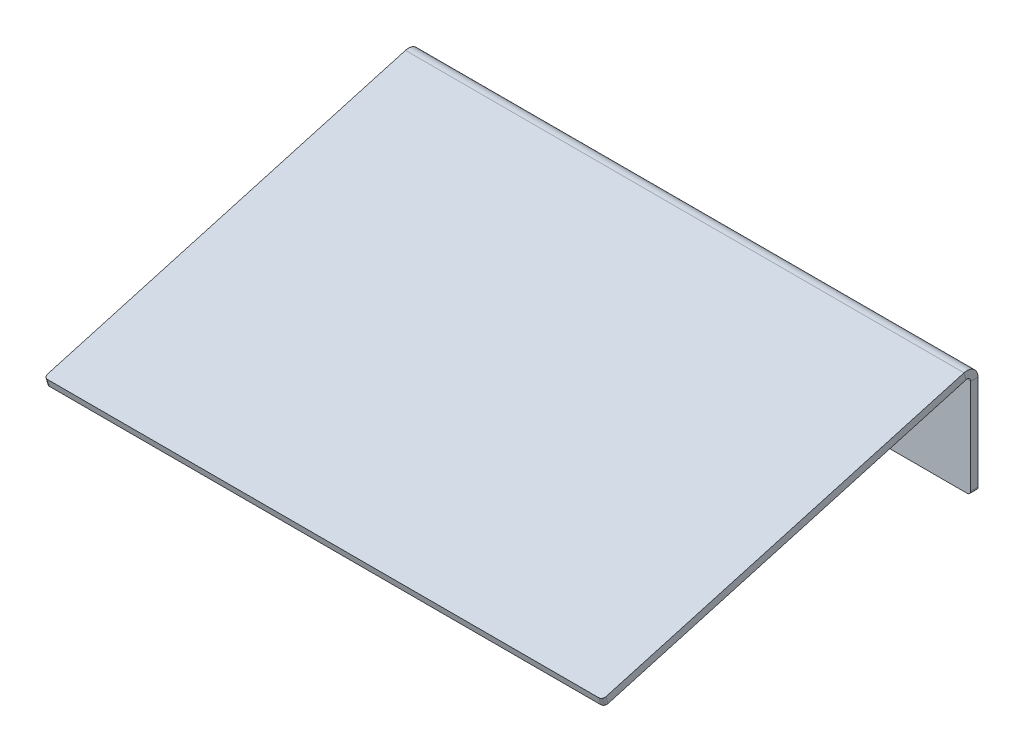
ISO-10303-21;
HEADER;
FILE_DESCRIPTION(('STEP AP214'),'2;1');
FILE_NAME('part.step','',(''),(''),'','','');
FILE_SCHEMA(('AUTOMOTIVE_DESIGN { 1 0 10303 214 1 1 1 1 }'));
ENDSEC;
DATA;
#1=APPLICATION_CONTEXT('core data for automotive mechanical design processes');
#2=APPLICATION_PROTOCOL_DEFINITION('international standard','automotive_design',2000,#1);
#3=PRODUCT_CONTEXT('',#1,'mechanical');
#4=PRODUCT('Part','Part','',(#3));
#5=PRODUCT_RELATED_PRODUCT_CATEGORY('part','',(#4));
#6=PRODUCT_DEFINITION_FORMATION('','',#4);
#7=PRODUCT_DEFINITION_CONTEXT('part definition',#1,'design');
#8=PRODUCT_DEFINITION('design','',#6,#7);
#9=PRODUCT_DEFINITION_SHAPE('','',#8);
#10=(LENGTH_UNIT() NAMED_UNIT(*) SI_UNIT(.MILLI.,.METRE.));
#11=(NAMED_UNIT(*) PLANE_ANGLE_UNIT() SI_UNIT($,.RADIAN.));
#12=(NAMED_UNIT(*) SI_UNIT($,.STERADIAN.) SOLID_ANGLE_UNIT());
#13=UNCERTAINTY_MEASURE_WITH_UNIT(LENGTH_MEASURE(1.E-05),#10,'distance_accuracy_value','');
#14=(GEOMETRIC_REPRESENTATION_CONTEXT(3) GLOBAL_UNCERTAINTY_ASSIGNED_CONTEXT((#13)) GLOBAL_UNIT_ASSIGNED_CONTEXT((#10,
#11,#12)) REPRESENTATION_CONTEXT('',''));
#15=CARTESIAN_POINT('',(0.,0.,0.));
#16=DIRECTION('',(0.,0.,1.));
#17=DIRECTION('',(1.,0.,0.));
#18=AXIS2_PLACEMENT_3D('',#15,#16,#17);
#19=CARTESIAN_POINT('',(152.5,0.,0.));
#20=DIRECTION('',(0.,1.,0.));
#21=DIRECTION('',(-1.,0.,0.));
#22=AXIS2_PLACEMENT_3D('',#19,#20,#21);
#23=PLANE('',#22);
#24=DIRECTION('',(1.,0.,0.));
#25=VECTOR('',#24,1.);
#26=CARTESIAN_POINT('',(152.5,0.,-4.));
#27=LINE('',#26,#25);
#28=CARTESIAN_POINT('',(150.5,0.,-4.));
#29=VERTEX_POINT('',#28);
#30=CARTESIAN_POINT('',(-150.5,0.,-4.));
#31=VERTEX_POINT('',#30);
#32=EDGE_CURVE('E202',#29,#31,#27,.F.);
#33=ORIENTED_EDGE('',*,*,#32,.F.);
#34=DIRECTION('',(0.,0.,1.));
#35=VECTOR('',#34,1.);
#36=CARTESIAN_POINT('',(150.5,0.,0.));
#37=LINE('',#36,#35);
#38=CARTESIAN_POINT('',(150.5,0.,0.));
#39=VERTEX_POINT('',#38);
#40=EDGE_CURVE('E213',#29,#39,#37,.T.);
#41=ORIENTED_EDGE('',*,*,#40,.T.);
#42=DIRECTION('',(-1.,0.,0.));
#43=VECTOR('',#42,1.);
#44=CARTESIAN_POINT('',(152.5,0.,0.));
#45=LINE('',#44,#43);
#46=CARTESIAN_POINT('',(-150.5,0.,0.));
#47=VERTEX_POINT('',#46);
#48=EDGE_CURVE('E141',#39,#47,#45,.T.);
#49=ORIENTED_EDGE('',*,*,#48,.T.);
#50=DIRECTION('',(0.,0.,-1.));
#51=VECTOR('',#50,1.);
#52=CARTESIAN_POINT('',(-150.5,0.,0.));
#53=LINE('',#52,#51);
#54=EDGE_CURVE('E152',#47,#31,#53,.T.);
#55=ORIENTED_EDGE('',*,*,#54,.T.);
#56=EDGE_LOOP('',(#33,#41,#49,#55));
#57=FACE_BOUND('',#56,.T.);
#58=ADVANCED_FACE('F38',(#57),#23,.F.);
#59=CARTESIAN_POINT('',(152.5,54.,0.));
#60=DIRECTION('',(1.,0.,0.));
#61=DIRECTION('',(0.,1.,0.));
#62=AXIS2_PLACEMENT_3D('',#59,#60,#61);
#63=PLANE('',#62);
#64=DIRECTION('',(0.,1.,0.));
#65=VECTOR('',#64,1.);
#66=CARTESIAN_POINT('',(152.5,54.,0.));
#67=LINE('',#66,#65);
#68=CARTESIAN_POINT('',(152.5,2.,0.));
#69=VERTEX_POINT('',#68);
#70=CARTESIAN_POINT('',(152.5,54.,0.));
#71=VERTEX_POINT('',#70);
#72=EDGE_CURVE('E131',#69,#71,#67,.T.);
#73=ORIENTED_EDGE('',*,*,#72,.F.);
#74=DIRECTION('',(0.,0.,-1.));
#75=VECTOR('',#74,1.);
#76=CARTESIAN_POINT('',(152.5,2.,0.));
#77=LINE('',#76,#75);
#78=CARTESIAN_POINT('',(152.5,2.,-4.));
#79=VERTEX_POINT('',#78);
#80=EDGE_CURVE('E219',#69,#79,#77,.T.);
#81=ORIENTED_EDGE('',*,*,#80,.T.);
#82=DIRECTION('',(0.,-1.,0.));
#83=VECTOR('',#82,1.);
#84=CARTESIAN_POINT('',(152.5,54.,-4.));
#85=LINE('',#84,#83);
#86=CARTESIAN_POINT('',(152.5,54.,-4.));
#87=VERTEX_POINT('',#86);
#88=EDGE_CURVE('E148',#79,#87,#85,.F.);
#89=ORIENTED_EDGE('',*,*,#88,.T.);
#90=DIRECTION('',(0.,0.,1.));
#91=VECTOR('',#90,1.);
#92=CARTESIAN_POINT('',(152.5,54.,0.));
#93=LINE('',#92,#91);
#94=EDGE_CURVE('E144',#87,#71,#93,.T.);
#95=ORIENTED_EDGE('',*,*,#94,.T.);
#96=EDGE_LOOP('',(#73,#81,#89,#95));
#97=FACE_BOUND('',#96,.T.);
#98=ADVANCED_FACE('F146',(#97),#63,.T.);
#99=CARTESIAN_POINT('',(152.5,54.,2.));
#100=DIRECTION('',(-1.,0.,0.));
#101=DIRECTION('',(0.,0.,1.));
#102=AXIS2_PLACEMENT_3D('',#99,#100,#101);
#103=PLANE('',#102);
#104=ORIENTED_EDGE('',*,*,#94,.F.);
#105=CARTESIAN_POINT('',(152.5,54.,2.));
#106=DIRECTION('',(-1.,0.,0.));
#107=DIRECTION('',(0.,0.,1.));
#108=AXIS2_PLACEMENT_3D('',#105,#106,#107);
#109=CIRCLE('',#108,5.99999999999999);
#110=CARTESIAN_POINT('',(152.5,59.7729234440283,3.63503972715922));
#111=VERTEX_POINT('',#110);
#112=EDGE_CURVE('E193',#87,#111,#109,.F.);
#113=ORIENTED_EDGE('',*,*,#112,.T.);
#114=DIRECTION('',(0.,-0.962153907338043,-0.272506621193204));
#115=VECTOR('',#114,1.);
#116=CARTESIAN_POINT('',(152.5,55.9243078146761,2.54501324238641));
#117=LINE('',#116,#115);
#118=CARTESIAN_POINT('',(152.5,55.9243078146761,2.54501324238641));
#119=VERTEX_POINT('',#118);
#120=EDGE_CURVE('E153',#111,#119,#117,.T.);
#121=ORIENTED_EDGE('',*,*,#120,.T.);
#122=CARTESIAN_POINT('',(152.5,54.,2.));
#123=DIRECTION('',(1.,0.,0.));
#124=DIRECTION('',(0.,0.,-1.));
#125=AXIS2_PLACEMENT_3D('',#122,#123,#124);
#126=CIRCLE('',#125,1.99999999999999);
#127=EDGE_CURVE('E156',#71,#119,#126,.T.);
#128=ORIENTED_EDGE('',*,*,#127,.F.);
#129=EDGE_LOOP('',(#104,#113,#121,#128));
#130=FACE_BOUND('',#129,.T.);
#131=ADVANCED_FACE('F157',(#130),#103,.F.);
#132=CARTESIAN_POINT('',(152.5,55.9243078146761,2.54501324238641));
#133=DIRECTION('',(1.,0.,0.));
#134=DIRECTION('',(0.,-0.272506621193204,0.962153907338043));
#135=AXIS2_PLACEMENT_3D('',#132,#133,#134);
#136=PLANE('',#135);
#137=DIRECTION('',(0.,0.272506621193204,-0.962153907338043));
#138=VECTOR('',#137,1.);
#139=CARTESIAN_POINT('',(152.5,59.7729234440283,3.63503972715922));
#140=LINE('',#139,#138);
#141=CARTESIAN_POINT('',(152.5,4.3936288717386,199.165718670097));
#142=VERTEX_POINT('',#141);
#143=EDGE_CURVE('E189',#111,#142,#140,.F.);
#144=ORIENTED_EDGE('',*,*,#143,.T.);
#145=DIRECTION('',(0.,-0.962153907338043,-0.272506621193204));
#146=VECTOR('',#145,1.);
#147=CARTESIAN_POINT('',(152.5,0.545013242386427,198.075692185324));
#148=LINE('',#147,#146);
#149=CARTESIAN_POINT('',(152.5,0.545013242386427,198.075692185324));
#150=VERTEX_POINT('',#149);
#151=EDGE_CURVE('E11',#142,#150,#148,.T.);
#152=ORIENTED_EDGE('',*,*,#151,.T.);
#153=DIRECTION('',(0.,-0.272506621193204,0.962153907338043));
#154=VECTOR('',#153,1.);
#155=CARTESIAN_POINT('',(152.5,55.9243078146761,2.54501324238641));
#156=LINE('',#155,#154);
#157=EDGE_CURVE('E175',#119,#150,#156,.T.);
#158=ORIENTED_EDGE('',*,*,#157,.F.);
#159=ORIENTED_EDGE('',*,*,#120,.F.);
#160=EDGE_LOOP('',(#144,#152,#158,#159));
#161=FACE_BOUND('',#160,.T.);
#162=ADVANCED_FACE('F308',(#161),#136,.T.);
#163=CARTESIAN_POINT('',(152.5,0.,200.));
#164=DIRECTION('',(0.,-0.272506621193204,0.962153907338043));
#165=DIRECTION('',(-1.,0.,0.));
#166=AXIS2_PLACEMENT_3D('',#163,#164,#165);
#167=PLANE('',#166);
#168=DIRECTION('',(1.,0.,0.));
#169=VECTOR('',#168,1.);
#170=CARTESIAN_POINT('',(152.5,3.84861562935217,201.090026484773));
#171=LINE('',#170,#169);
#172=CARTESIAN_POINT('',(150.5,3.84861562935217,201.090026484773));
#173=VERTEX_POINT('',#172);
#174=CARTESIAN_POINT('',(-150.5,3.84861562935217,201.090026484773));
#175=VERTEX_POINT('',#174);
#176=EDGE_CURVE('E194',#173,#175,#171,.F.);
#177=ORIENTED_EDGE('',*,*,#176,.T.);
#178=DIRECTION('',(0.,0.962153907338043,0.272506621193204));
#179=VECTOR('',#178,1.);
#180=CARTESIAN_POINT('',(-150.5,0.,200.));
#181=LINE('',#180,#179);
#182=CARTESIAN_POINT('',(-150.5,0.,200.));
#183=VERTEX_POINT('',#182);
#184=EDGE_CURVE('E230',#175,#183,#181,.F.);
#185=ORIENTED_EDGE('',*,*,#184,.T.);
#186=DIRECTION('',(-1.,0.,0.));
#187=VECTOR('',#186,1.);
#188=CARTESIAN_POINT('',(152.5,0.,200.));
#189=LINE('',#188,#187);
#190=CARTESIAN_POINT('',(150.5,0.,200.));
#191=VERTEX_POINT('',#190);
#192=EDGE_CURVE('E178',#191,#183,#189,.T.);
#193=ORIENTED_EDGE('',*,*,#192,.F.);
#194=DIRECTION('',(0.,-0.962153907338043,-0.272506621193204));
#195=VECTOR('',#194,1.);
#196=CARTESIAN_POINT('',(150.5,0.,200.));
#197=LINE('',#196,#195);
#198=EDGE_CURVE('E228',#191,#173,#197,.F.);
#199=ORIENTED_EDGE('',*,*,#198,.T.);
#200=EDGE_LOOP('',(#177,#185,#193,#199));
#201=FACE_BOUND('',#200,.T.);
#202=ADVANCED_FACE('F243',(#201),#167,.T.);
#203=CARTESIAN_POINT('',(-152.5,55.9243078146761,2.54501324238641));
#204=DIRECTION('',(1.,0.,0.));
#205=DIRECTION('',(0.,-0.272506621193204,0.962153907338043));
#206=AXIS2_PLACEMENT_3D('',#203,#204,#205);
#207=PLANE('',#206);
#208=DIRECTION('',(0.,-0.272506621193204,0.962153907338043));
#209=VECTOR('',#208,1.);
#210=CARTESIAN_POINT('',(-152.5,55.9243078146761,2.54501324238641));
#211=LINE('',#210,#209);
#212=CARTESIAN_POINT('',(-152.5,55.9243078146761,2.54501324238641));
#213=VERTEX_POINT('',#212);
#214=CARTESIAN_POINT('',(-152.5,0.545013242386413,198.075692185324));
#215=VERTEX_POINT('',#214);
#216=EDGE_CURVE('E168',#213,#215,#211,.T.);
#217=ORIENTED_EDGE('',*,*,#216,.T.);
#218=DIRECTION('',(0.,-0.962153907338043,-0.272506621193204));
#219=VECTOR('',#218,1.);
#220=CARTESIAN_POINT('',(-152.5,0.545013242386406,198.075692185324));
#221=LINE('',#220,#219);
#222=CARTESIAN_POINT('',(-152.5,4.39362887173859,199.165718670097));
#223=VERTEX_POINT('',#222);
#224=EDGE_CURVE('E61',#215,#223,#221,.F.);
#225=ORIENTED_EDGE('',*,*,#224,.T.);
#226=DIRECTION('',(0.,0.272506621193204,-0.962153907338043));
#227=VECTOR('',#226,1.);
#228=CARTESIAN_POINT('',(-152.5,59.7729234440283,3.63503972715922));
#229=LINE('',#228,#227);
#230=CARTESIAN_POINT('',(-152.5,59.7729234440283,3.63503972715922));
#231=VERTEX_POINT('',#230);
#232=EDGE_CURVE('E185',#231,#223,#229,.F.);
#233=ORIENTED_EDGE('',*,*,#232,.F.);
#234=DIRECTION('',(0.,-0.962153907338044,-0.272506621193203));
#235=VECTOR('',#234,1.);
#236=CARTESIAN_POINT('',(-152.5,55.9243078146761,2.54501324238641));
#237=LINE('',#236,#235);
#238=EDGE_CURVE('E207',#231,#213,#237,.T.);
#239=ORIENTED_EDGE('',*,*,#238,.T.);
#240=EDGE_LOOP('',(#217,#225,#233,#239));
#241=FACE_BOUND('',#240,.T.);
#242=ADVANCED_FACE('F250',(#241),#207,.F.);
#243=CARTESIAN_POINT('',(-152.5,54.,2.));
#244=DIRECTION('',(-1.,0.,0.));
#245=DIRECTION('',(0.,0.,1.));
#246=AXIS2_PLACEMENT_3D('',#243,#244,#245);
#247=PLANE('',#246);
#248=ORIENTED_EDGE('',*,*,#238,.F.);
#249=CARTESIAN_POINT('',(-152.5,54.,2.));
#250=DIRECTION('',(-1.,0.,0.));
#251=DIRECTION('',(0.,0.,1.));
#252=AXIS2_PLACEMENT_3D('',#249,#250,#251);
#253=CIRCLE('',#252,5.99999999999999);
#254=CARTESIAN_POINT('',(-152.5,54.,-3.99999999999999));
#255=VERTEX_POINT('',#254);
#256=EDGE_CURVE('E190',#255,#231,#253,.F.);
#257=ORIENTED_EDGE('',*,*,#256,.F.);
#258=DIRECTION('',(0.,0.,1.));
#259=VECTOR('',#258,1.);
#260=CARTESIAN_POINT('',(-152.5,54.,0.));
#261=LINE('',#260,#259);
#262=CARTESIAN_POINT('',(-152.5,54.,0.));
#263=VERTEX_POINT('',#262);
#264=EDGE_CURVE('E162',#255,#263,#261,.T.);
#265=ORIENTED_EDGE('',*,*,#264,.T.);
#266=CARTESIAN_POINT('',(-152.5,54.,2.));
#267=DIRECTION('',(1.,0.,0.));
#268=DIRECTION('',(0.,0.,-1.));
#269=AXIS2_PLACEMENT_3D('',#266,#267,#268);
#270=CIRCLE('',#269,1.99999999999999);
#271=EDGE_CURVE('E163',#263,#213,#270,.T.);
#272=ORIENTED_EDGE('',*,*,#271,.T.);
#273=EDGE_LOOP('',(#248,#257,#265,#272));
#274=FACE_BOUND('',#273,.T.);
#275=ADVANCED_FACE('F253',(#274),#247,.T.);
#276=CARTESIAN_POINT('',(-152.5,54.,0.));
#277=DIRECTION('',(1.,0.,0.));
#278=DIRECTION('',(0.,1.,0.));
#279=AXIS2_PLACEMENT_3D('',#276,#277,#278);
#280=PLANE('',#279);
#281=DIRECTION('',(0.,-1.,0.));
#282=VECTOR('',#281,1.);
#283=CARTESIAN_POINT('',(-152.5,54.,-4.));
#284=LINE('',#283,#282);
#285=CARTESIAN_POINT('',(-152.5,2.,-4.));
#286=VERTEX_POINT('',#285);
#287=EDGE_CURVE('E205',#286,#255,#284,.F.);
#288=ORIENTED_EDGE('',*,*,#287,.F.);
#289=DIRECTION('',(0.,0.,-1.));
#290=VECTOR('',#289,1.);
#291=CARTESIAN_POINT('',(-152.5,2.,0.));
#292=LINE('',#291,#290);
#293=CARTESIAN_POINT('',(-152.5,2.,0.));
#294=VERTEX_POINT('',#293);
#295=EDGE_CURVE('E225',#286,#294,#292,.F.);
#296=ORIENTED_EDGE('',*,*,#295,.T.);
#297=DIRECTION('',(0.,1.,0.));
#298=VECTOR('',#297,1.);
#299=CARTESIAN_POINT('',(-152.5,54.,0.));
#300=LINE('',#299,#298);
#301=EDGE_CURVE('E200',#294,#263,#300,.T.);
#302=ORIENTED_EDGE('',*,*,#301,.T.);
#303=ORIENTED_EDGE('',*,*,#264,.F.);
#304=EDGE_LOOP('',(#288,#296,#302,#303));
#305=FACE_BOUND('',#304,.T.);
#306=ADVANCED_FACE('F266',(#305),#280,.F.);
#307=CARTESIAN_POINT('',(152.5,54.,2.));
#308=DIRECTION('',(-1.,0.,0.));
#309=DIRECTION('',(0.,0.,1.));
#310=AXIS2_PLACEMENT_3D('',#307,#308,#309);
#311=CYLINDRICAL_SURFACE('',#310,1.99999999999999);
#312=ORIENTED_EDGE('',*,*,#271,.F.);
#313=DIRECTION('',(-1.,0.,0.));
#314=VECTOR('',#313,1.);
#315=CARTESIAN_POINT('',(152.5,54.,0.));
#316=LINE('',#315,#314);
#317=EDGE_CURVE('E137',#71,#263,#316,.T.);
#318=ORIENTED_EDGE('',*,*,#317,.F.);
#319=ORIENTED_EDGE('',*,*,#127,.T.);
#320=DIRECTION('',(-1.,0.,0.));
#321=VECTOR('',#320,1.);
#322=CARTESIAN_POINT('',(152.5,55.9243078146761,2.54501324238641));
#323=LINE('',#322,#321);
#324=EDGE_CURVE('E170',#119,#213,#323,.T.);
#325=ORIENTED_EDGE('',*,*,#324,.T.);
#326=EDGE_LOOP('',(#312,#318,#319,#325));
#327=FACE_BOUND('',#326,.T.);
#328=ADVANCED_FACE('F166',(#327),#311,.F.);
#329=CARTESIAN_POINT('',(152.5,55.9243078146761,2.54501324238641));
#330=DIRECTION('',(0.,-0.962153907338043,-0.272506621193204));
#331=DIRECTION('',(0.,0.272506621193204,-0.962153907338043));
#332=AXIS2_PLACEMENT_3D('',#329,#330,#331);
#333=PLANE('',#332);
#334=ORIENTED_EDGE('',*,*,#192,.T.);
#335=CARTESIAN_POINT('',(-150.5,0.545013242386407,198.075692185324));
#336=DIRECTION('',(0.,-0.962153907338043,-0.272506621193204));
#337=DIRECTION('',(0.,0.272506621193204,-0.962153907338043));
#338=AXIS2_PLACEMENT_3D('',#335,#336,#337);
#339=CIRCLE('',#338,2.);
#340=EDGE_CURVE('E235',#183,#215,#339,.T.);
#341=ORIENTED_EDGE('',*,*,#340,.T.);
#342=ORIENTED_EDGE('',*,*,#216,.F.);
#343=ORIENTED_EDGE('',*,*,#324,.F.);
#344=ORIENTED_EDGE('',*,*,#157,.T.);
#345=CARTESIAN_POINT('',(150.5,0.545013242386413,198.075692185324));
#346=DIRECTION('',(0.,-0.962153907338043,-0.272506621193204));
#347=DIRECTION('',(0.,0.272506621193204,-0.962153907338043));
#348=AXIS2_PLACEMENT_3D('',#345,#346,#347);
#349=CIRCLE('',#348,2.);
#350=EDGE_CURVE('E233',#150,#191,#349,.T.);
#351=ORIENTED_EDGE('',*,*,#350,.T.);
#352=EDGE_LOOP('',(#334,#341,#342,#343,#344,#351));
#353=FACE_BOUND('',#352,.T.);
#354=ADVANCED_FACE('F249',(#353),#333,.T.);
#355=CARTESIAN_POINT('',(152.5,54.,0.));
#356=DIRECTION('',(0.,0.,1.));
#357=DIRECTION('',(0.,-1.,0.));
#358=AXIS2_PLACEMENT_3D('',#355,#356,#357);
#359=PLANE('',#358);
#360=ORIENTED_EDGE('',*,*,#48,.F.);
#361=CARTESIAN_POINT('',(150.5,2.,0.));
#362=DIRECTION('',(0.,0.,1.));
#363=DIRECTION('',(0.,-1.,0.));
#364=AXIS2_PLACEMENT_3D('',#361,#362,#363);
#365=CIRCLE('',#364,2.);
#366=EDGE_CURVE('E138',#39,#69,#365,.T.);
#367=ORIENTED_EDGE('',*,*,#366,.T.);
#368=ORIENTED_EDGE('',*,*,#72,.T.);
#369=ORIENTED_EDGE('',*,*,#317,.T.);
#370=ORIENTED_EDGE('',*,*,#301,.F.);
#371=CARTESIAN_POINT('',(-150.5,2.,0.));
#372=DIRECTION('',(0.,0.,1.));
#373=DIRECTION('',(0.,-1.,0.));
#374=AXIS2_PLACEMENT_3D('',#371,#372,#373);
#375=CIRCLE('',#374,2.);
#376=EDGE_CURVE('E216',#294,#47,#375,.T.);
#377=ORIENTED_EDGE('',*,*,#376,.T.);
#378=EDGE_LOOP('',(#360,#367,#368,#369,#370,#377));
#379=FACE_BOUND('',#378,.T.);
#380=ADVANCED_FACE('F134',(#379),#359,.T.);
#381=CARTESIAN_POINT('',(152.5,54.,2.));
#382=DIRECTION('',(-1.,0.,0.));
#383=DIRECTION('',(0.,0.,1.));
#384=AXIS2_PLACEMENT_3D('',#381,#382,#383);
#385=CYLINDRICAL_SURFACE('',#384,5.99999999999999);
#386=ORIENTED_EDGE('',*,*,#256,.T.);
#387=DIRECTION('',(-1.,0.,0.));
#388=VECTOR('',#387,1.);
#389=CARTESIAN_POINT('',(152.5,59.7729234440283,3.63503972715922));
#390=LINE('',#389,#388);
#391=EDGE_CURVE('E186',#111,#231,#390,.T.);
#392=ORIENTED_EDGE('',*,*,#391,.F.);
#393=ORIENTED_EDGE('',*,*,#112,.F.);
#394=DIRECTION('',(1.,0.,0.));
#395=VECTOR('',#394,1.);
#396=CARTESIAN_POINT('',(152.5,54.,-4.));
#397=LINE('',#396,#395);
#398=EDGE_CURVE('E182',#87,#255,#397,.F.);
#399=ORIENTED_EDGE('',*,*,#398,.T.);
#400=EDGE_LOOP('',(#386,#392,#393,#399));
#401=FACE_BOUND('',#400,.T.);
#402=ADVANCED_FACE('F257',(#401),#385,.T.);
#403=CARTESIAN_POINT('',(152.5,59.7729234440283,3.63503972715922));
#404=DIRECTION('',(0.,-0.962153907338043,-0.272506621193204));
#405=DIRECTION('',(0.,0.272506621193204,-0.962153907338043));
#406=AXIS2_PLACEMENT_3D('',#403,#404,#405);
#407=PLANE('',#406);
#408=ORIENTED_EDGE('',*,*,#232,.T.);
#409=CARTESIAN_POINT('',(-150.5,4.39362887173858,199.165718670097));
#410=DIRECTION('',(0.,-0.962153907338043,-0.272506621193204));
#411=DIRECTION('',(0.,0.272506621193204,-0.962153907338043));
#412=AXIS2_PLACEMENT_3D('',#409,#410,#411);
#413=CIRCLE('',#412,2.);
#414=EDGE_CURVE('E46',#223,#175,#413,.F.);
#415=ORIENTED_EDGE('',*,*,#414,.T.);
#416=ORIENTED_EDGE('',*,*,#176,.F.);
#417=CARTESIAN_POINT('',(150.5,4.3936288717386,199.165718670097));
#418=DIRECTION('',(0.,-0.962153907338043,-0.272506621193204));
#419=DIRECTION('',(0.,0.272506621193204,-0.962153907338043));
#420=AXIS2_PLACEMENT_3D('',#417,#418,#419);
#421=CIRCLE('',#420,2.);
#422=EDGE_CURVE('E53',#173,#142,#421,.F.);
#423=ORIENTED_EDGE('',*,*,#422,.T.);
#424=ORIENTED_EDGE('',*,*,#143,.F.);
#425=ORIENTED_EDGE('',*,*,#391,.T.);
#426=EDGE_LOOP('',(#408,#415,#416,#423,#424,#425));
#427=FACE_BOUND('',#426,.T.);
#428=ADVANCED_FACE('F239',(#427),#407,.F.);
#429=CARTESIAN_POINT('',(152.5,54.,-4.));
#430=DIRECTION('',(0.,0.,1.));
#431=DIRECTION('',(0.,-1.,0.));
#432=AXIS2_PLACEMENT_3D('',#429,#430,#431);
#433=PLANE('',#432);
#434=ORIENTED_EDGE('',*,*,#88,.F.);
#435=CARTESIAN_POINT('',(150.5,2.,-4.));
#436=DIRECTION('',(0.,0.,1.));
#437=DIRECTION('',(0.,-1.,0.));
#438=AXIS2_PLACEMENT_3D('',#435,#436,#437);
#439=CIRCLE('',#438,2.);
#440=EDGE_CURVE('E223',#79,#29,#439,.F.);
#441=ORIENTED_EDGE('',*,*,#440,.T.);
#442=ORIENTED_EDGE('',*,*,#32,.T.);
#443=CARTESIAN_POINT('',(-150.5,2.,-4.));
#444=DIRECTION('',(0.,0.,1.));
#445=DIRECTION('',(0.,-1.,0.));
#446=AXIS2_PLACEMENT_3D('',#443,#444,#445);
#447=CIRCLE('',#446,2.);
#448=EDGE_CURVE('E221',#31,#286,#447,.F.);
#449=ORIENTED_EDGE('',*,*,#448,.T.);
#450=ORIENTED_EDGE('',*,*,#287,.T.);
#451=ORIENTED_EDGE('',*,*,#398,.F.);
#452=EDGE_LOOP('',(#434,#441,#442,#449,#450,#451));
#453=FACE_BOUND('',#452,.T.);
#454=ADVANCED_FACE('F259',(#453),#433,.F.);
#455=CARTESIAN_POINT('',(150.5,2.,0.));
#456=DIRECTION('',(0.,0.,-1.));
#457=DIRECTION('',(0.,1.,0.));
#458=AXIS2_PLACEMENT_3D('',#455,#456,#457);
#459=CYLINDRICAL_SURFACE('',#458,2.);
#460=ORIENTED_EDGE('',*,*,#440,.F.);
#461=ORIENTED_EDGE('',*,*,#80,.F.);
#462=ORIENTED_EDGE('',*,*,#366,.F.);
#463=ORIENTED_EDGE('',*,*,#40,.F.);
#464=EDGE_LOOP('',(#460,#461,#462,#463));
#465=FACE_BOUND('',#464,.T.);
#466=ADVANCED_FACE('F276',(#465),#459,.T.);
#467=CARTESIAN_POINT('',(-150.5,2.,0.));
#468=DIRECTION('',(0.,0.,1.));
#469=DIRECTION('',(0.,-1.,0.));
#470=AXIS2_PLACEMENT_3D('',#467,#468,#469);
#471=CYLINDRICAL_SURFACE('',#470,2.);
#472=ORIENTED_EDGE('',*,*,#448,.F.);
#473=ORIENTED_EDGE('',*,*,#54,.F.);
#474=ORIENTED_EDGE('',*,*,#376,.F.);
#475=ORIENTED_EDGE('',*,*,#295,.F.);
#476=EDGE_LOOP('',(#472,#473,#474,#475));
#477=FACE_BOUND('',#476,.T.);
#478=ADVANCED_FACE('F274',(#477),#471,.T.);
#479=CARTESIAN_POINT('',(-150.5,0.545013242386407,198.075692185324));
#480=DIRECTION('',(0.,0.962153907338043,0.272506621193204));
#481=DIRECTION('',(0.,-0.272506621193204,0.962153907338043));
#482=AXIS2_PLACEMENT_3D('',#479,#480,#481);
#483=CYLINDRICAL_SURFACE('',#482,2.);
#484=ORIENTED_EDGE('',*,*,#414,.F.);
#485=ORIENTED_EDGE('',*,*,#224,.F.);
#486=ORIENTED_EDGE('',*,*,#340,.F.);
#487=ORIENTED_EDGE('',*,*,#184,.F.);
#488=EDGE_LOOP('',(#484,#485,#486,#487));
#489=FACE_BOUND('',#488,.T.);
#490=ADVANCED_FACE('F246',(#489),#483,.T.);
#491=CARTESIAN_POINT('',(150.5,0.545013242386413,198.075692185324));
#492=DIRECTION('',(0.,-0.962153907338043,-0.272506621193204));
#493=DIRECTION('',(0.,0.272506621193204,-0.962153907338043));
#494=AXIS2_PLACEMENT_3D('',#491,#492,#493);
#495=CYLINDRICAL_SURFACE('',#494,2.);
#496=ORIENTED_EDGE('',*,*,#422,.F.);
#497=ORIENTED_EDGE('',*,*,#198,.F.);
#498=ORIENTED_EDGE('',*,*,#350,.F.);
#499=ORIENTED_EDGE('',*,*,#151,.F.);
#500=EDGE_LOOP('',(#496,#497,#498,#499));
#501=FACE_BOUND('',#500,.T.);
#502=ADVANCED_FACE('F40',(#501),#495,.T.);
#503=CLOSED_SHELL('',(#58,#98,#131,#162,#202,#242,#275,#306,#328,#354,#380,#402,#428,#454,#466,
#478,#490,#502));
#504=MANIFOLD_SOLID_BREP('B2',#503);
#505=ADVANCED_BREP_SHAPE_REPRESENTATION('',(#18,#504),#14);
#506=SHAPE_DEFINITION_REPRESENTATION(#9,#505);
ENDSEC;
END-ISO-10303-21;
